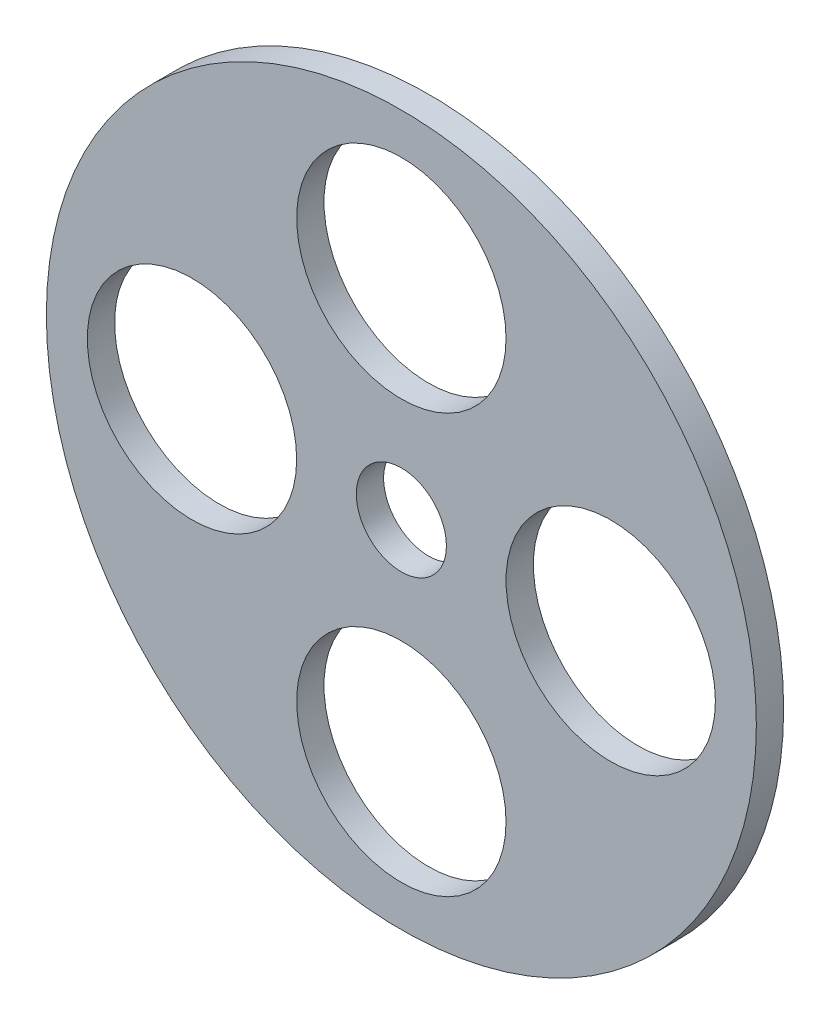
ISO-10303-21;
HEADER;
FILE_DESCRIPTION(('STEP AP214'),'2;1');
FILE_NAME('part.step','',(''),(''),'','','');
FILE_SCHEMA(('AUTOMOTIVE_DESIGN { 1 0 10303 214 1 1 1 1 }'));
ENDSEC;
DATA;
#1=APPLICATION_CONTEXT('core data for automotive mechanical design processes');
#2=APPLICATION_PROTOCOL_DEFINITION('international standard','automotive_design',2000,#1);
#3=PRODUCT_CONTEXT('',#1,'mechanical');
#4=PRODUCT('Part','Part','',(#3));
#5=PRODUCT_RELATED_PRODUCT_CATEGORY('part','',(#4));
#6=PRODUCT_DEFINITION_FORMATION('','',#4);
#7=PRODUCT_DEFINITION_CONTEXT('part definition',#1,'design');
#8=PRODUCT_DEFINITION('design','',#6,#7);
#9=PRODUCT_DEFINITION_SHAPE('','',#8);
#10=(LENGTH_UNIT() NAMED_UNIT(*) SI_UNIT(.MILLI.,.METRE.));
#11=(NAMED_UNIT(*) PLANE_ANGLE_UNIT() SI_UNIT($,.RADIAN.));
#12=(NAMED_UNIT(*) SI_UNIT($,.STERADIAN.) SOLID_ANGLE_UNIT());
#13=UNCERTAINTY_MEASURE_WITH_UNIT(LENGTH_MEASURE(1.E-05),#10,'distance_accuracy_value','');
#14=(GEOMETRIC_REPRESENTATION_CONTEXT(3) GLOBAL_UNCERTAINTY_ASSIGNED_CONTEXT((#13)) GLOBAL_UNIT_ASSIGNED_CONTEXT((#10,
#11,#12)) REPRESENTATION_CONTEXT('',''));
#15=CARTESIAN_POINT('',(0.,0.,0.));
#16=DIRECTION('',(0.,0.,1.));
#17=DIRECTION('',(1.,0.,0.));
#18=AXIS2_PLACEMENT_3D('',#15,#16,#17);
#19=CARTESIAN_POINT('',(0.,0.,3.));
#20=DIRECTION('',(0.,0.,1.));
#21=DIRECTION('',(1.,0.,0.));
#22=AXIS2_PLACEMENT_3D('',#19,#20,#21);
#23=PLANE('',#22);
#24=CARTESIAN_POINT('',(1.18881320888038E-12,-23.,3.));
#25=DIRECTION('',(0.,0.,1.));
#26=DIRECTION('',(1.,0.,0.));
#27=AXIS2_PLACEMENT_3D('',#24,#25,#26);
#28=CIRCLE('',#27,11.5);
#29=CARTESIAN_POINT('',(11.5000000000012,-23.,3.));
#30=VERTEX_POINT('',#29);
#31=EDGE_CURVE('E61',#30,#30,#28,.T.);
#32=ORIENTED_EDGE('',*,*,#31,.F.);
#33=EDGE_LOOP('',(#32));
#34=FACE_BOUND('',#33,.T.);
#35=CARTESIAN_POINT('',(0.,23.,3.));
#36=DIRECTION('',(0.,0.,1.));
#37=DIRECTION('',(1.,0.,0.));
#38=AXIS2_PLACEMENT_3D('',#35,#36,#37);
#39=CIRCLE('',#38,11.5);
#40=CARTESIAN_POINT('',(11.5,23.,3.));
#41=VERTEX_POINT('',#40);
#42=EDGE_CURVE('E49',#41,#41,#39,.T.);
#43=ORIENTED_EDGE('',*,*,#42,.F.);
#44=EDGE_LOOP('',(#43));
#45=FACE_BOUND('',#44,.T.);
#46=CARTESIAN_POINT('',(0.,0.,3.));
#47=DIRECTION('',(0.,0.,1.));
#48=DIRECTION('',(1.,0.,0.));
#49=AXIS2_PLACEMENT_3D('',#46,#47,#48);
#50=CIRCLE('',#49,39.);
#51=CARTESIAN_POINT('',(39.,0.,3.));
#52=VERTEX_POINT('',#51);
#53=EDGE_CURVE('E10',#52,#52,#50,.T.);
#54=ORIENTED_EDGE('',*,*,#53,.T.);
#55=EDGE_LOOP('',(#54));
#56=FACE_BOUND('',#55,.T.);
#57=CARTESIAN_POINT('',(0.,0.,3.));
#58=DIRECTION('',(0.,0.,1.));
#59=DIRECTION('',(1.,0.,0.));
#60=AXIS2_PLACEMENT_3D('',#57,#58,#59);
#61=CIRCLE('',#60,4.95);
#62=CARTESIAN_POINT('',(4.95,0.,3.));
#63=VERTEX_POINT('',#62);
#64=EDGE_CURVE('E44',#63,#63,#61,.T.);
#65=ORIENTED_EDGE('',*,*,#64,.F.);
#66=EDGE_LOOP('',(#65));
#67=FACE_BOUND('',#66,.T.);
#68=CARTESIAN_POINT('',(23.0000000000006,5.9440660444019E-13,3.));
#69=DIRECTION('',(0.,0.,1.));
#70=DIRECTION('',(1.,0.,0.));
#71=AXIS2_PLACEMENT_3D('',#68,#69,#70);
#72=CIRCLE('',#71,11.5);
#73=CARTESIAN_POINT('',(34.5000000000006,5.9440660444019E-13,3.));
#74=VERTEX_POINT('',#73);
#75=EDGE_CURVE('E55',#74,#74,#72,.T.);
#76=ORIENTED_EDGE('',*,*,#75,.F.);
#77=EDGE_LOOP('',(#76));
#78=FACE_BOUND('',#77,.T.);
#79=CARTESIAN_POINT('',(-22.9999999999994,-5.97223292078228E-13,3.));
#80=DIRECTION('',(0.,0.,1.));
#81=DIRECTION('',(1.,0.,0.));
#82=AXIS2_PLACEMENT_3D('',#79,#80,#81);
#83=CIRCLE('',#82,11.5);
#84=CARTESIAN_POINT('',(-11.4999999999994,-5.97223292078228E-13,3.));
#85=VERTEX_POINT('',#84);
#86=EDGE_CURVE('E67',#85,#85,#83,.T.);
#87=ORIENTED_EDGE('',*,*,#86,.F.);
#88=EDGE_LOOP('',(#87));
#89=FACE_BOUND('',#88,.T.);
#90=ADVANCED_FACE('F33',(#34,#45,#56,#67,#78,#89),#23,.T.);
#91=CARTESIAN_POINT('',(0.,0.,0.));
#92=DIRECTION('',(0.,0.,1.));
#93=DIRECTION('',(1.,0.,0.));
#94=AXIS2_PLACEMENT_3D('',#91,#92,#93);
#95=PLANE('',#94);
#96=CARTESIAN_POINT('',(0.,0.,0.));
#97=DIRECTION('',(0.,0.,1.));
#98=DIRECTION('',(1.,0.,0.));
#99=AXIS2_PLACEMENT_3D('',#96,#97,#98);
#100=CIRCLE('',#99,39.);
#101=CARTESIAN_POINT('',(39.,0.,0.));
#102=VERTEX_POINT('',#101);
#103=EDGE_CURVE('E37',#102,#102,#100,.T.);
#104=ORIENTED_EDGE('',*,*,#103,.F.);
#105=EDGE_LOOP('',(#104));
#106=FACE_BOUND('',#105,.T.);
#107=CARTESIAN_POINT('',(0.,0.,0.));
#108=DIRECTION('',(0.,0.,1.));
#109=DIRECTION('',(1.,0.,0.));
#110=AXIS2_PLACEMENT_3D('',#107,#108,#109);
#111=CIRCLE('',#110,4.95);
#112=CARTESIAN_POINT('',(4.95,0.,0.));
#113=VERTEX_POINT('',#112);
#114=EDGE_CURVE('E46',#113,#113,#111,.T.);
#115=ORIENTED_EDGE('',*,*,#114,.T.);
#116=EDGE_LOOP('',(#115));
#117=FACE_BOUND('',#116,.T.);
#118=CARTESIAN_POINT('',(0.,23.,0.));
#119=DIRECTION('',(0.,0.,1.));
#120=DIRECTION('',(1.,0.,0.));
#121=AXIS2_PLACEMENT_3D('',#118,#119,#120);
#122=CIRCLE('',#121,11.5);
#123=CARTESIAN_POINT('',(11.5,23.,0.));
#124=VERTEX_POINT('',#123);
#125=EDGE_CURVE('E52',#124,#124,#122,.T.);
#126=ORIENTED_EDGE('',*,*,#125,.T.);
#127=EDGE_LOOP('',(#126));
#128=FACE_BOUND('',#127,.T.);
#129=CARTESIAN_POINT('',(23.0000000000006,5.9440660444019E-13,0.));
#130=DIRECTION('',(0.,0.,1.));
#131=DIRECTION('',(1.,0.,0.));
#132=AXIS2_PLACEMENT_3D('',#129,#130,#131);
#133=CIRCLE('',#132,11.5);
#134=CARTESIAN_POINT('',(34.5000000000006,5.9440660444019E-13,0.));
#135=VERTEX_POINT('',#134);
#136=EDGE_CURVE('E58',#135,#135,#133,.T.);
#137=ORIENTED_EDGE('',*,*,#136,.T.);
#138=EDGE_LOOP('',(#137));
#139=FACE_BOUND('',#138,.T.);
#140=CARTESIAN_POINT('',(1.18881320888038E-12,-23.,0.));
#141=DIRECTION('',(0.,0.,1.));
#142=DIRECTION('',(1.,0.,0.));
#143=AXIS2_PLACEMENT_3D('',#140,#141,#142);
#144=CIRCLE('',#143,11.5);
#145=CARTESIAN_POINT('',(11.5000000000012,-23.,0.));
#146=VERTEX_POINT('',#145);
#147=EDGE_CURVE('E64',#146,#146,#144,.T.);
#148=ORIENTED_EDGE('',*,*,#147,.T.);
#149=EDGE_LOOP('',(#148));
#150=FACE_BOUND('',#149,.T.);
#151=CARTESIAN_POINT('',(-22.9999999999994,-5.97223292078228E-13,0.));
#152=DIRECTION('',(0.,0.,1.));
#153=DIRECTION('',(1.,0.,0.));
#154=AXIS2_PLACEMENT_3D('',#151,#152,#153);
#155=CIRCLE('',#154,11.5);
#156=CARTESIAN_POINT('',(-11.4999999999994,-5.97223292078228E-13,0.));
#157=VERTEX_POINT('',#156);
#158=EDGE_CURVE('E70',#157,#157,#155,.T.);
#159=ORIENTED_EDGE('',*,*,#158,.T.);
#160=EDGE_LOOP('',(#159));
#161=FACE_BOUND('',#160,.T.);
#162=ADVANCED_FACE('F80',(#106,#117,#128,#139,#150,#161),#95,.F.);
#163=CARTESIAN_POINT('',(0.,0.,3.));
#164=DIRECTION('',(0.,0.,-1.));
#165=DIRECTION('',(-1.,0.,0.));
#166=AXIS2_PLACEMENT_3D('',#163,#164,#165);
#167=CYLINDRICAL_SURFACE('',#166,39.);
#168=ORIENTED_EDGE('',*,*,#53,.F.);
#169=EDGE_LOOP('',(#168));
#170=FACE_BOUND('',#169,.T.);
#171=ORIENTED_EDGE('',*,*,#103,.T.);
#172=EDGE_LOOP('',(#171));
#173=FACE_BOUND('',#172,.T.);
#174=ADVANCED_FACE('F35',(#170,#173),#167,.T.);
#175=CARTESIAN_POINT('',(0.,0.,3.));
#176=DIRECTION('',(0.,0.,-1.));
#177=DIRECTION('',(-1.,0.,0.));
#178=AXIS2_PLACEMENT_3D('',#175,#176,#177);
#179=CYLINDRICAL_SURFACE('',#178,4.95);
#180=ORIENTED_EDGE('',*,*,#64,.T.);
#181=EDGE_LOOP('',(#180));
#182=FACE_BOUND('',#181,.T.);
#183=ORIENTED_EDGE('',*,*,#114,.F.);
#184=EDGE_LOOP('',(#183));
#185=FACE_BOUND('',#184,.T.);
#186=ADVANCED_FACE('F90',(#182,#185),#179,.F.);
#187=CARTESIAN_POINT('',(0.,23.,3.));
#188=DIRECTION('',(0.,0.,-1.));
#189=DIRECTION('',(-1.,0.,0.));
#190=AXIS2_PLACEMENT_3D('',#187,#188,#189);
#191=CYLINDRICAL_SURFACE('',#190,11.5);
#192=ORIENTED_EDGE('',*,*,#42,.T.);
#193=EDGE_LOOP('',(#192));
#194=FACE_BOUND('',#193,.T.);
#195=ORIENTED_EDGE('',*,*,#125,.F.);
#196=EDGE_LOOP('',(#195));
#197=FACE_BOUND('',#196,.T.);
#198=ADVANCED_FACE('F93',(#194,#197),#191,.F.);
#199=CARTESIAN_POINT('',(23.0000000000006,5.9440660444019E-13,3.));
#200=DIRECTION('',(0.,0.,-1.));
#201=DIRECTION('',(-1.,0.,0.));
#202=AXIS2_PLACEMENT_3D('',#199,#200,#201);
#203=CYLINDRICAL_SURFACE('',#202,11.5);
#204=ORIENTED_EDGE('',*,*,#75,.T.);
#205=EDGE_LOOP('',(#204));
#206=FACE_BOUND('',#205,.T.);
#207=ORIENTED_EDGE('',*,*,#136,.F.);
#208=EDGE_LOOP('',(#207));
#209=FACE_BOUND('',#208,.T.);
#210=ADVANCED_FACE('F97',(#206,#209),#203,.F.);
#211=CARTESIAN_POINT('',(1.18881320888038E-12,-23.,3.));
#212=DIRECTION('',(0.,0.,-1.));
#213=DIRECTION('',(-1.,0.,0.));
#214=AXIS2_PLACEMENT_3D('',#211,#212,#213);
#215=CYLINDRICAL_SURFACE('',#214,11.5);
#216=ORIENTED_EDGE('',*,*,#31,.T.);
#217=EDGE_LOOP('',(#216));
#218=FACE_BOUND('',#217,.T.);
#219=ORIENTED_EDGE('',*,*,#147,.F.);
#220=EDGE_LOOP('',(#219));
#221=FACE_BOUND('',#220,.T.);
#222=ADVANCED_FACE('F101',(#218,#221),#215,.F.);
#223=CARTESIAN_POINT('',(-22.9999999999994,-5.97223292078228E-13,3.));
#224=DIRECTION('',(0.,0.,-1.));
#225=DIRECTION('',(-1.,0.,0.));
#226=AXIS2_PLACEMENT_3D('',#223,#224,#225);
#227=CYLINDRICAL_SURFACE('',#226,11.5);
#228=ORIENTED_EDGE('',*,*,#86,.T.);
#229=EDGE_LOOP('',(#228));
#230=FACE_BOUND('',#229,.T.);
#231=ORIENTED_EDGE('',*,*,#158,.F.);
#232=EDGE_LOOP('',(#231));
#233=FACE_BOUND('',#232,.T.);
#234=ADVANCED_FACE('F76',(#230,#233),#227,.F.);
#235=CLOSED_SHELL('',(#90,#162,#174,#186,#198,#210,#222,#234));
#236=MANIFOLD_SOLID_BREP('B2',#235);
#237=ADVANCED_BREP_SHAPE_REPRESENTATION('',(#18,#236),#14);
#238=SHAPE_DEFINITION_REPRESENTATION(#9,#237);
ENDSEC;
END-ISO-10303-21;
